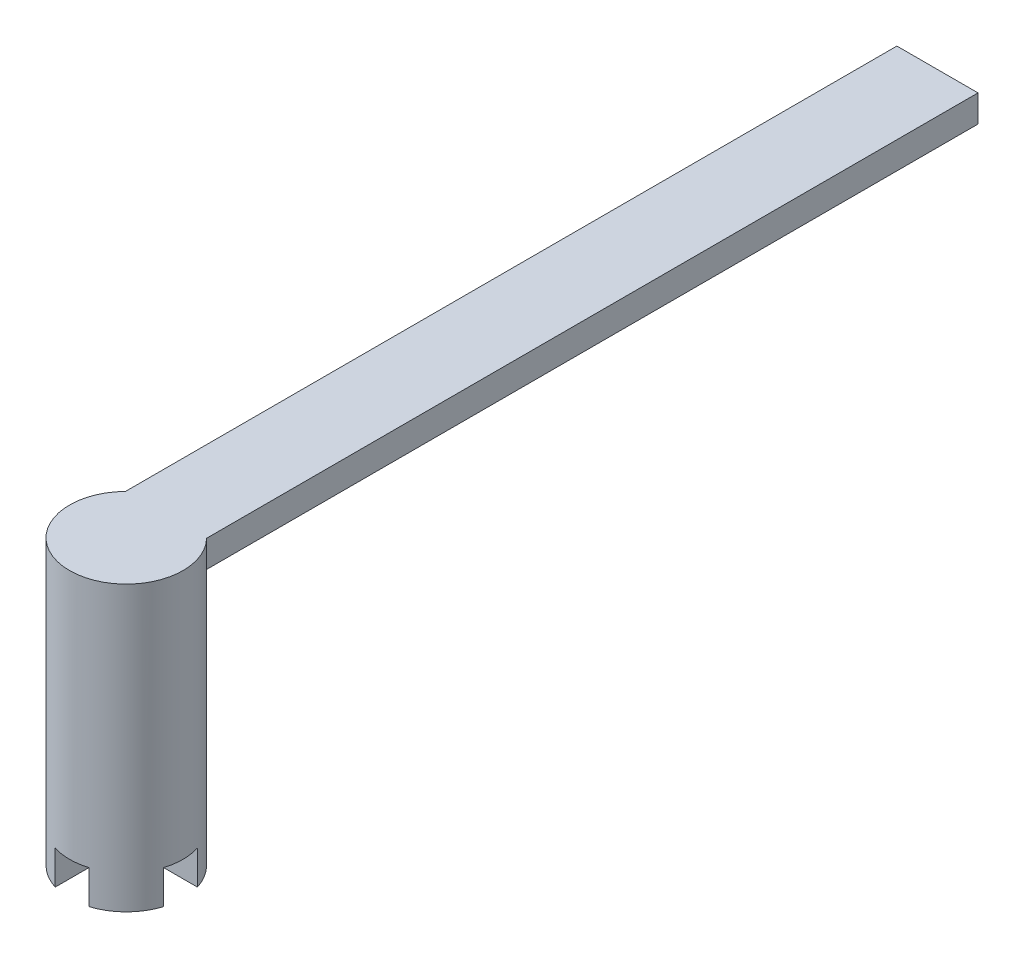
ISO-10303-21;
HEADER;
FILE_DESCRIPTION(('STEP AP214'),'2;1');
FILE_NAME('part.step','',(''),(''),'','','');
FILE_SCHEMA(('AUTOMOTIVE_DESIGN { 1 0 10303 214 1 1 1 1 }'));
ENDSEC;
DATA;
#1=APPLICATION_CONTEXT('core data for automotive mechanical design processes');
#2=APPLICATION_PROTOCOL_DEFINITION('international standard','automotive_design',2000,#1);
#3=PRODUCT_CONTEXT('',#1,'mechanical');
#4=PRODUCT('Part','Part','',(#3));
#5=PRODUCT_RELATED_PRODUCT_CATEGORY('part','',(#4));
#6=PRODUCT_DEFINITION_FORMATION('','',#4);
#7=PRODUCT_DEFINITION_CONTEXT('part definition',#1,'design');
#8=PRODUCT_DEFINITION('design','',#6,#7);
#9=PRODUCT_DEFINITION_SHAPE('','',#8);
#10=(LENGTH_UNIT() NAMED_UNIT(*) SI_UNIT(.MILLI.,.METRE.));
#11=(NAMED_UNIT(*) PLANE_ANGLE_UNIT() SI_UNIT($,.RADIAN.));
#12=(NAMED_UNIT(*) SI_UNIT($,.STERADIAN.) SOLID_ANGLE_UNIT());
#13=UNCERTAINTY_MEASURE_WITH_UNIT(LENGTH_MEASURE(1.E-05),#10,'distance_accuracy_value','');
#14=(GEOMETRIC_REPRESENTATION_CONTEXT(3) GLOBAL_UNCERTAINTY_ASSIGNED_CONTEXT((#13)) GLOBAL_UNIT_ASSIGNED_CONTEXT((#10,
#11,#12)) REPRESENTATION_CONTEXT('',''));
#15=CARTESIAN_POINT('',(0.,0.,0.));
#16=DIRECTION('',(0.,0.,1.));
#17=DIRECTION('',(1.,0.,0.));
#18=AXIS2_PLACEMENT_3D('',#15,#16,#17);
#19=CARTESIAN_POINT('',(0.,2.54,0.));
#20=DIRECTION('',(0.,-1.,0.));
#21=DIRECTION('',(0.,0.,-1.));
#22=AXIS2_PLACEMENT_3D('',#19,#20,#21);
#23=CYLINDRICAL_SURFACE('',#22,5.334);
#24=DIRECTION('',(0.,-1.,0.));
#25=VECTOR('',#24,1.);
#26=CARTESIAN_POINT('',(-3.81,2.54,-3.73302236800156));
#27=LINE('',#26,#25);
#28=CARTESIAN_POINT('',(-3.81,2.54,-3.73302236800156));
#29=VERTEX_POINT('',#28);
#30=CARTESIAN_POINT('',(-3.81,0.,-3.73302236800156));
#31=VERTEX_POINT('',#30);
#32=EDGE_CURVE('E62',#29,#31,#27,.T.);
#33=ORIENTED_EDGE('',*,*,#32,.T.);
#34=CARTESIAN_POINT('',(0.,0.,0.));
#35=DIRECTION('',(0.,-1.,0.));
#36=DIRECTION('',(0.,0.,-1.));
#37=AXIS2_PLACEMENT_3D('',#34,#35,#36);
#38=CIRCLE('',#37,5.334);
#39=CARTESIAN_POINT('',(3.81,0.,-3.73302236800156));
#40=VERTEX_POINT('',#39);
#41=EDGE_CURVE('E11',#31,#40,#38,.T.);
#42=ORIENTED_EDGE('',*,*,#41,.T.);
#43=DIRECTION('',(0.,-1.,0.));
#44=VECTOR('',#43,1.);
#45=CARTESIAN_POINT('',(3.81,2.54,-3.73302236800156));
#46=LINE('',#45,#44);
#47=CARTESIAN_POINT('',(3.81,2.54,-3.73302236800156));
#48=VERTEX_POINT('',#47);
#49=EDGE_CURVE('E45',#48,#40,#46,.T.);
#50=ORIENTED_EDGE('',*,*,#49,.F.);
#51=CARTESIAN_POINT('',(0.,2.54,0.));
#52=DIRECTION('',(0.,1.,0.));
#53=DIRECTION('',(0.,0.,1.));
#54=AXIS2_PLACEMENT_3D('',#51,#52,#53);
#55=CIRCLE('',#54,5.334);
#56=EDGE_CURVE('E195',#29,#48,#55,.T.);
#57=ORIENTED_EDGE('',*,*,#56,.F.);
#58=EDGE_LOOP('',(#33,#42,#50,#57));
#59=FACE_BOUND('',#58,.T.);
#60=DIRECTION('',(0.,-1.,0.));
#61=VECTOR('',#60,1.);
#62=CARTESIAN_POINT('',(5.09228826265756,-20.955,1.5875));
#63=LINE('',#62,#61);
#64=CARTESIAN_POINT('',(5.09228826265756,-20.955,1.5875));
#65=VERTEX_POINT('',#64);
#66=CARTESIAN_POINT('',(5.09228826265756,-24.13,1.5875));
#67=VERTEX_POINT('',#66);
#68=EDGE_CURVE('E456',#65,#67,#63,.T.);
#69=ORIENTED_EDGE('',*,*,#68,.F.);
#70=CARTESIAN_POINT('',(0.,-20.955,0.));
#71=DIRECTION('',(0.,-1.,0.));
#72=DIRECTION('',(0.,0.,-1.));
#73=AXIS2_PLACEMENT_3D('',#70,#71,#72);
#74=CIRCLE('',#73,5.334);
#75=CARTESIAN_POINT('',(5.09228826265756,-20.955,-1.5875));
#76=VERTEX_POINT('',#75);
#77=EDGE_CURVE('E488',#76,#65,#74,.T.);
#78=ORIENTED_EDGE('',*,*,#77,.F.);
#79=DIRECTION('',(0.,-1.,0.));
#80=VECTOR('',#79,1.);
#81=CARTESIAN_POINT('',(5.09228826265756,-20.955,-1.5875));
#82=LINE('',#81,#80);
#83=CARTESIAN_POINT('',(5.09228826265756,-24.13,-1.5875));
#84=VERTEX_POINT('',#83);
#85=EDGE_CURVE('E458',#76,#84,#82,.T.);
#86=ORIENTED_EDGE('',*,*,#85,.T.);
#87=CARTESIAN_POINT('',(0.,-24.13,0.));
#88=DIRECTION('',(0.,-1.,0.));
#89=DIRECTION('',(0.,0.,-1.));
#90=AXIS2_PLACEMENT_3D('',#87,#88,#89);
#91=CIRCLE('',#90,5.334);
#92=CARTESIAN_POINT('',(1.5875,-24.13,-5.09228826265756));
#93=VERTEX_POINT('',#92);
#94=EDGE_CURVE('E190',#93,#84,#91,.T.);
#95=ORIENTED_EDGE('',*,*,#94,.F.);
#96=DIRECTION('',(0.,-1.,0.));
#97=VECTOR('',#96,1.);
#98=CARTESIAN_POINT('',(1.5875,-20.955,-5.09228826265756));
#99=LINE('',#98,#97);
#100=CARTESIAN_POINT('',(1.5875,-20.955,-5.09228826265756));
#101=VERTEX_POINT('',#100);
#102=EDGE_CURVE('E462',#101,#93,#99,.T.);
#103=ORIENTED_EDGE('',*,*,#102,.F.);
#104=CARTESIAN_POINT('',(0.,-20.955,0.));
#105=DIRECTION('',(0.,-1.,0.));
#106=DIRECTION('',(0.,0.,-1.));
#107=AXIS2_PLACEMENT_3D('',#104,#105,#106);
#108=CIRCLE('',#107,5.334);
#109=CARTESIAN_POINT('',(-1.5875,-20.955,-5.09228826265756));
#110=VERTEX_POINT('',#109);
#111=EDGE_CURVE('E466',#110,#101,#108,.T.);
#112=ORIENTED_EDGE('',*,*,#111,.F.);
#113=DIRECTION('',(0.,-1.,0.));
#114=VECTOR('',#113,1.);
#115=CARTESIAN_POINT('',(-1.5875,-20.955,-5.09228826265756));
#116=LINE('',#115,#114);
#117=CARTESIAN_POINT('',(-1.5875,-24.13,-5.09228826265756));
#118=VERTEX_POINT('',#117);
#119=EDGE_CURVE('E184',#110,#118,#116,.T.);
#120=ORIENTED_EDGE('',*,*,#119,.T.);
#121=CARTESIAN_POINT('',(-5.09228826265756,-24.13,-1.5875));
#122=VERTEX_POINT('',#121);
#123=EDGE_CURVE('E182',#122,#118,#91,.T.);
#124=ORIENTED_EDGE('',*,*,#123,.F.);
#125=DIRECTION('',(0.,-1.,0.));
#126=VECTOR('',#125,1.);
#127=CARTESIAN_POINT('',(-5.09228826265756,-20.955,-1.5875));
#128=LINE('',#127,#126);
#129=CARTESIAN_POINT('',(-5.09228826265756,-20.955,-1.5875));
#130=VERTEX_POINT('',#129);
#131=EDGE_CURVE('E53',#130,#122,#128,.T.);
#132=ORIENTED_EDGE('',*,*,#131,.F.);
#133=CARTESIAN_POINT('',(0.,-20.955,0.));
#134=DIRECTION('',(0.,-1.,0.));
#135=DIRECTION('',(0.,0.,-1.));
#136=AXIS2_PLACEMENT_3D('',#133,#134,#135);
#137=CIRCLE('',#136,5.334);
#138=CARTESIAN_POINT('',(-5.09228826265756,-20.955,1.5875));
#139=VERTEX_POINT('',#138);
#140=EDGE_CURVE('E167',#139,#130,#137,.T.);
#141=ORIENTED_EDGE('',*,*,#140,.F.);
#142=DIRECTION('',(0.,-1.,0.));
#143=VECTOR('',#142,1.);
#144=CARTESIAN_POINT('',(-5.09228826265756,-20.955,1.5875));
#145=LINE('',#144,#143);
#146=CARTESIAN_POINT('',(-5.09228826265756,-24.13,1.5875));
#147=VERTEX_POINT('',#146);
#148=EDGE_CURVE('E445',#139,#147,#145,.T.);
#149=ORIENTED_EDGE('',*,*,#148,.T.);
#150=CARTESIAN_POINT('',(-1.5875,-24.13,5.09228826265756));
#151=VERTEX_POINT('',#150);
#152=EDGE_CURVE('E469',#151,#147,#91,.T.);
#153=ORIENTED_EDGE('',*,*,#152,.F.);
#154=DIRECTION('',(0.,-1.,0.));
#155=VECTOR('',#154,1.);
#156=CARTESIAN_POINT('',(-1.5875,-20.955,5.09228826265756));
#157=LINE('',#156,#155);
#158=CARTESIAN_POINT('',(-1.5875,-20.955,5.09228826265756));
#159=VERTEX_POINT('',#158);
#160=EDGE_CURVE('E449',#159,#151,#157,.T.);
#161=ORIENTED_EDGE('',*,*,#160,.F.);
#162=CARTESIAN_POINT('',(0.,-20.955,0.));
#163=DIRECTION('',(0.,-1.,0.));
#164=DIRECTION('',(0.,0.,-1.));
#165=AXIS2_PLACEMENT_3D('',#162,#163,#164);
#166=CIRCLE('',#165,5.334);
#167=CARTESIAN_POINT('',(1.5875,-20.955,5.09228826265756));
#168=VERTEX_POINT('',#167);
#169=EDGE_CURVE('E479',#168,#159,#166,.T.);
#170=ORIENTED_EDGE('',*,*,#169,.F.);
#171=DIRECTION('',(0.,-1.,0.));
#172=VECTOR('',#171,1.);
#173=CARTESIAN_POINT('',(1.5875,-20.955,5.09228826265756));
#174=LINE('',#173,#172);
#175=CARTESIAN_POINT('',(1.5875,-24.13,5.09228826265756));
#176=VERTEX_POINT('',#175);
#177=EDGE_CURVE('E451',#168,#176,#174,.T.);
#178=ORIENTED_EDGE('',*,*,#177,.T.);
#179=EDGE_CURVE('E194',#67,#176,#91,.T.);
#180=ORIENTED_EDGE('',*,*,#179,.F.);
#181=EDGE_LOOP('',(#69,#78,#86,#95,#103,#112,#120,#124,#132,#141,#149,#153,#161,#170,#178,#180));
#182=FACE_BOUND('',#181,.T.);
#183=ADVANCED_FACE('F37',(#59,#182),#23,.T.);
#184=CARTESIAN_POINT('',(0.,-24.13,0.));
#185=DIRECTION('',(0.,-1.,0.));
#186=DIRECTION('',(0.,0.,-1.));
#187=AXIS2_PLACEMENT_3D('',#184,#185,#186);
#188=PLANE('',#187);
#189=ORIENTED_EDGE('',*,*,#152,.T.);
#190=DIRECTION('',(1.,0.,0.));
#191=VECTOR('',#190,1.);
#192=CARTESIAN_POINT('',(0.,-24.13,1.5875));
#193=LINE('',#192,#191);
#194=CARTESIAN_POINT('',(-1.5875,-24.13,1.5875));
#195=VERTEX_POINT('',#194);
#196=EDGE_CURVE('E176',#147,#195,#193,.T.);
#197=ORIENTED_EDGE('',*,*,#196,.T.);
#198=DIRECTION('',(0.,0.,-1.));
#199=VECTOR('',#198,1.);
#200=CARTESIAN_POINT('',(-1.5875,-24.13,0.));
#201=LINE('',#200,#199);
#202=EDGE_CURVE('E440',#151,#195,#201,.T.);
#203=ORIENTED_EDGE('',*,*,#202,.F.);
#204=EDGE_LOOP('',(#189,#197,#203));
#205=FACE_BOUND('',#204,.T.);
#206=ADVANCED_FACE('F244',(#205),#188,.T.);
#207=ORIENTED_EDGE('',*,*,#179,.T.);
#208=DIRECTION('',(0.,0.,-1.));
#209=VECTOR('',#208,1.);
#210=CARTESIAN_POINT('',(1.5875,-24.13,0.));
#211=LINE('',#210,#209);
#212=CARTESIAN_POINT('',(1.5875,-24.13,1.5875));
#213=VERTEX_POINT('',#212);
#214=EDGE_CURVE('E432',#176,#213,#211,.T.);
#215=ORIENTED_EDGE('',*,*,#214,.T.);
#216=DIRECTION('',(1.,0.,0.));
#217=VECTOR('',#216,1.);
#218=CARTESIAN_POINT('',(0.,-24.13,1.5875));
#219=LINE('',#218,#217);
#220=EDGE_CURVE('E429',#213,#67,#219,.T.);
#221=ORIENTED_EDGE('',*,*,#220,.T.);
#222=EDGE_LOOP('',(#207,#215,#221));
#223=FACE_BOUND('',#222,.T.);
#224=ADVANCED_FACE('F252',(#223),#188,.T.);
#225=DIRECTION('',(1.,0.,0.));
#226=VECTOR('',#225,1.);
#227=CARTESIAN_POINT('',(0.,-24.13,-1.5875));
#228=LINE('',#227,#226);
#229=CARTESIAN_POINT('',(1.5875,-24.13,-1.5875));
#230=VERTEX_POINT('',#229);
#231=EDGE_CURVE('E424',#230,#84,#228,.T.);
#232=ORIENTED_EDGE('',*,*,#231,.F.);
#233=DIRECTION('',(0.,0.,-1.));
#234=VECTOR('',#233,1.);
#235=CARTESIAN_POINT('',(1.5875,-24.13,0.));
#236=LINE('',#235,#234);
#237=EDGE_CURVE('E426',#230,#93,#236,.T.);
#238=ORIENTED_EDGE('',*,*,#237,.T.);
#239=ORIENTED_EDGE('',*,*,#94,.T.);
#240=EDGE_LOOP('',(#232,#238,#239));
#241=FACE_BOUND('',#240,.T.);
#242=ADVANCED_FACE('F245',(#241),#188,.T.);
#243=CARTESIAN_POINT('',(0.,0.,0.));
#244=DIRECTION('',(0.,1.,0.));
#245=DIRECTION('',(0.,0.,1.));
#246=AXIS2_PLACEMENT_3D('',#243,#244,#245);
#247=PLANE('',#246);
#248=ORIENTED_EDGE('',*,*,#41,.F.);
#249=DIRECTION('',(0.,0.,-1.));
#250=VECTOR('',#249,1.);
#251=CARTESIAN_POINT('',(-3.81,0.,0.));
#252=LINE('',#251,#250);
#253=CARTESIAN_POINT('',(-3.81,0.,-76.2));
#254=VERTEX_POINT('',#253);
#255=EDGE_CURVE('E197',#31,#254,#252,.T.);
#256=ORIENTED_EDGE('',*,*,#255,.T.);
#257=DIRECTION('',(1.,0.,0.));
#258=VECTOR('',#257,1.);
#259=CARTESIAN_POINT('',(0.,0.,-76.2));
#260=LINE('',#259,#258);
#261=CARTESIAN_POINT('',(3.80999999999997,0.,-76.2));
#262=VERTEX_POINT('',#261);
#263=EDGE_CURVE('E204',#254,#262,#260,.T.);
#264=ORIENTED_EDGE('',*,*,#263,.T.);
#265=DIRECTION('',(0.,0.,-1.));
#266=VECTOR('',#265,1.);
#267=CARTESIAN_POINT('',(3.81,0.,0.));
#268=LINE('',#267,#266);
#269=EDGE_CURVE('E193',#40,#262,#268,.T.);
#270=ORIENTED_EDGE('',*,*,#269,.F.);
#271=EDGE_LOOP('',(#248,#256,#264,#270));
#272=FACE_BOUND('',#271,.T.);
#273=ADVANCED_FACE('F220',(#272),#247,.F.);
#274=CARTESIAN_POINT('',(3.81,2.54,0.));
#275=DIRECTION('',(-1.,0.,0.));
#276=DIRECTION('',(0.,0.,1.));
#277=AXIS2_PLACEMENT_3D('',#274,#275,#276);
#278=PLANE('',#277);
#279=ORIENTED_EDGE('',*,*,#269,.T.);
#280=DIRECTION('',(0.,-1.,0.));
#281=VECTOR('',#280,1.);
#282=CARTESIAN_POINT('',(3.80999999999997,2.54,-76.2));
#283=LINE('',#282,#281);
#284=CARTESIAN_POINT('',(3.80999999999997,2.54,-76.2));
#285=VERTEX_POINT('',#284);
#286=EDGE_CURVE('E209',#285,#262,#283,.T.);
#287=ORIENTED_EDGE('',*,*,#286,.F.);
#288=DIRECTION('',(0.,0.,-1.));
#289=VECTOR('',#288,1.);
#290=CARTESIAN_POINT('',(3.81,2.54,0.));
#291=LINE('',#290,#289);
#292=EDGE_CURVE('E87',#48,#285,#291,.T.);
#293=ORIENTED_EDGE('',*,*,#292,.F.);
#294=ORIENTED_EDGE('',*,*,#49,.T.);
#295=EDGE_LOOP('',(#279,#287,#293,#294));
#296=FACE_BOUND('',#295,.T.);
#297=ADVANCED_FACE('F228',(#296),#278,.F.);
#298=CARTESIAN_POINT('',(0.,2.54,-76.2));
#299=DIRECTION('',(0.,0.,-1.));
#300=DIRECTION('',(-1.,0.,0.));
#301=AXIS2_PLACEMENT_3D('',#298,#299,#300);
#302=PLANE('',#301);
#303=ORIENTED_EDGE('',*,*,#263,.F.);
#304=DIRECTION('',(0.,-1.,0.));
#305=VECTOR('',#304,1.);
#306=CARTESIAN_POINT('',(-3.81,2.54,-76.2));
#307=LINE('',#306,#305);
#308=CARTESIAN_POINT('',(-3.81,2.54,-76.2));
#309=VERTEX_POINT('',#308);
#310=EDGE_CURVE('E207',#309,#254,#307,.T.);
#311=ORIENTED_EDGE('',*,*,#310,.F.);
#312=DIRECTION('',(1.,0.,0.));
#313=VECTOR('',#312,1.);
#314=CARTESIAN_POINT('',(0.,2.54,-76.2));
#315=LINE('',#314,#313);
#316=EDGE_CURVE('E199',#309,#285,#315,.T.);
#317=ORIENTED_EDGE('',*,*,#316,.T.);
#318=ORIENTED_EDGE('',*,*,#286,.T.);
#319=EDGE_LOOP('',(#303,#311,#317,#318));
#320=FACE_BOUND('',#319,.T.);
#321=ADVANCED_FACE('F226',(#320),#302,.T.);
#322=CARTESIAN_POINT('',(-3.81,2.54,0.));
#323=DIRECTION('',(-1.,0.,0.));
#324=DIRECTION('',(0.,0.,1.));
#325=AXIS2_PLACEMENT_3D('',#322,#323,#324);
#326=PLANE('',#325);
#327=ORIENTED_EDGE('',*,*,#255,.F.);
#328=ORIENTED_EDGE('',*,*,#32,.F.);
#329=DIRECTION('',(0.,0.,-1.));
#330=VECTOR('',#329,1.);
#331=CARTESIAN_POINT('',(-3.81,2.54,0.));
#332=LINE('',#331,#330);
#333=EDGE_CURVE('E202',#29,#309,#332,.T.);
#334=ORIENTED_EDGE('',*,*,#333,.T.);
#335=ORIENTED_EDGE('',*,*,#310,.T.);
#336=EDGE_LOOP('',(#327,#328,#334,#335));
#337=FACE_BOUND('',#336,.T.);
#338=ADVANCED_FACE('F222',(#337),#326,.T.);
#339=CARTESIAN_POINT('',(0.,2.54,0.));
#340=DIRECTION('',(0.,1.,0.));
#341=DIRECTION('',(0.,0.,1.));
#342=AXIS2_PLACEMENT_3D('',#339,#340,#341);
#343=PLANE('',#342);
#344=ORIENTED_EDGE('',*,*,#56,.T.);
#345=ORIENTED_EDGE('',*,*,#292,.T.);
#346=ORIENTED_EDGE('',*,*,#316,.F.);
#347=ORIENTED_EDGE('',*,*,#333,.F.);
#348=EDGE_LOOP('',(#344,#345,#346,#347));
#349=FACE_BOUND('',#348,.T.);
#350=ADVANCED_FACE('F233',(#349),#343,.T.);
#351=DIRECTION('',(0.,0.,-1.));
#352=VECTOR('',#351,1.);
#353=CARTESIAN_POINT('',(-1.5875,-24.13,0.));
#354=LINE('',#353,#352);
#355=CARTESIAN_POINT('',(-1.5875,-24.13,-1.5875));
#356=VERTEX_POINT('',#355);
#357=EDGE_CURVE('E434',#356,#118,#354,.T.);
#358=ORIENTED_EDGE('',*,*,#357,.F.);
#359=DIRECTION('',(1.,0.,0.));
#360=VECTOR('',#359,1.);
#361=CARTESIAN_POINT('',(0.,-24.13,-1.5875));
#362=LINE('',#361,#360);
#363=EDGE_CURVE('E468',#122,#356,#362,.T.);
#364=ORIENTED_EDGE('',*,*,#363,.F.);
#365=ORIENTED_EDGE('',*,*,#123,.T.);
#366=EDGE_LOOP('',(#358,#364,#365));
#367=FACE_BOUND('',#366,.T.);
#368=ADVANCED_FACE('F235',(#367),#188,.T.);
#369=CARTESIAN_POINT('',(0.,-20.955,1.5875));
#370=DIRECTION('',(0.,0.,-1.));
#371=DIRECTION('',(-1.,0.,0.));
#372=AXIS2_PLACEMENT_3D('',#369,#370,#371);
#373=PLANE('',#372);
#374=ORIENTED_EDGE('',*,*,#196,.F.);
#375=ORIENTED_EDGE('',*,*,#148,.F.);
#376=DIRECTION('',(1.,0.,0.));
#377=VECTOR('',#376,1.);
#378=CARTESIAN_POINT('',(0.,-20.955,1.5875));
#379=LINE('',#378,#377);
#380=CARTESIAN_POINT('',(-1.5875,-20.955,1.5875));
#381=VERTEX_POINT('',#380);
#382=EDGE_CURVE('E173',#139,#381,#379,.T.);
#383=ORIENTED_EDGE('',*,*,#382,.T.);
#384=DIRECTION('',(0.,-1.,0.));
#385=VECTOR('',#384,1.);
#386=CARTESIAN_POINT('',(-1.5875,-20.955,1.5875));
#387=LINE('',#386,#385);
#388=EDGE_CURVE('E447',#381,#195,#387,.T.);
#389=ORIENTED_EDGE('',*,*,#388,.T.);
#390=EDGE_LOOP('',(#374,#375,#383,#389));
#391=FACE_BOUND('',#390,.T.);
#392=ADVANCED_FACE('F241',(#391),#373,.T.);
#393=CARTESIAN_POINT('',(-1.5875,-20.955,0.));
#394=DIRECTION('',(-1.,0.,0.));
#395=DIRECTION('',(0.,0.,1.));
#396=AXIS2_PLACEMENT_3D('',#393,#394,#395);
#397=PLANE('',#396);
#398=ORIENTED_EDGE('',*,*,#202,.T.);
#399=ORIENTED_EDGE('',*,*,#388,.F.);
#400=DIRECTION('',(0.,0.,-1.));
#401=VECTOR('',#400,1.);
#402=CARTESIAN_POINT('',(-1.5875,-20.955,0.));
#403=LINE('',#402,#401);
#404=EDGE_CURVE('E186',#159,#381,#403,.T.);
#405=ORIENTED_EDGE('',*,*,#404,.F.);
#406=ORIENTED_EDGE('',*,*,#160,.T.);
#407=EDGE_LOOP('',(#398,#399,#405,#406));
#408=FACE_BOUND('',#407,.T.);
#409=ADVANCED_FACE('F281',(#408),#397,.F.);
#410=CARTESIAN_POINT('',(1.5875,-20.955,0.));
#411=DIRECTION('',(-1.,0.,0.));
#412=DIRECTION('',(0.,0.,1.));
#413=AXIS2_PLACEMENT_3D('',#410,#411,#412);
#414=PLANE('',#413);
#415=ORIENTED_EDGE('',*,*,#214,.F.);
#416=ORIENTED_EDGE('',*,*,#177,.F.);
#417=DIRECTION('',(0.,0.,-1.));
#418=VECTOR('',#417,1.);
#419=CARTESIAN_POINT('',(1.5875,-20.955,0.));
#420=LINE('',#419,#418);
#421=CARTESIAN_POINT('',(1.5875,-20.955,1.5875));
#422=VERTEX_POINT('',#421);
#423=EDGE_CURVE('E481',#168,#422,#420,.T.);
#424=ORIENTED_EDGE('',*,*,#423,.T.);
#425=DIRECTION('',(0.,-1.,0.));
#426=VECTOR('',#425,1.);
#427=CARTESIAN_POINT('',(1.5875,-20.955,1.5875));
#428=LINE('',#427,#426);
#429=EDGE_CURVE('E454',#422,#213,#428,.T.);
#430=ORIENTED_EDGE('',*,*,#429,.T.);
#431=EDGE_LOOP('',(#415,#416,#424,#430));
#432=FACE_BOUND('',#431,.T.);
#433=ADVANCED_FACE('F277',(#432),#414,.T.);
#434=CARTESIAN_POINT('',(0.,-20.955,1.5875));
#435=DIRECTION('',(0.,0.,-1.));
#436=DIRECTION('',(-1.,0.,0.));
#437=AXIS2_PLACEMENT_3D('',#434,#435,#436);
#438=PLANE('',#437);
#439=ORIENTED_EDGE('',*,*,#220,.F.);
#440=ORIENTED_EDGE('',*,*,#429,.F.);
#441=DIRECTION('',(1.,0.,0.));
#442=VECTOR('',#441,1.);
#443=CARTESIAN_POINT('',(0.,-20.955,1.5875));
#444=LINE('',#443,#442);
#445=EDGE_CURVE('E485',#422,#65,#444,.T.);
#446=ORIENTED_EDGE('',*,*,#445,.T.);
#447=ORIENTED_EDGE('',*,*,#68,.T.);
#448=EDGE_LOOP('',(#439,#440,#446,#447));
#449=FACE_BOUND('',#448,.T.);
#450=ADVANCED_FACE('F273',(#449),#438,.T.);
#451=CARTESIAN_POINT('',(0.,-20.955,-1.5875));
#452=DIRECTION('',(0.,0.,-1.));
#453=DIRECTION('',(-1.,0.,0.));
#454=AXIS2_PLACEMENT_3D('',#451,#452,#453);
#455=PLANE('',#454);
#456=ORIENTED_EDGE('',*,*,#231,.T.);
#457=ORIENTED_EDGE('',*,*,#85,.F.);
#458=DIRECTION('',(1.,0.,0.));
#459=VECTOR('',#458,1.);
#460=CARTESIAN_POINT('',(0.,-20.955,-1.5875));
#461=LINE('',#460,#459);
#462=CARTESIAN_POINT('',(1.5875,-20.955,-1.5875));
#463=VERTEX_POINT('',#462);
#464=EDGE_CURVE('E498',#463,#76,#461,.T.);
#465=ORIENTED_EDGE('',*,*,#464,.F.);
#466=DIRECTION('',(0.,-1.,0.));
#467=VECTOR('',#466,1.);
#468=CARTESIAN_POINT('',(1.5875,-20.955,-1.5875));
#469=LINE('',#468,#467);
#470=EDGE_CURVE('E460',#463,#230,#469,.T.);
#471=ORIENTED_EDGE('',*,*,#470,.T.);
#472=EDGE_LOOP('',(#456,#457,#465,#471));
#473=FACE_BOUND('',#472,.T.);
#474=ADVANCED_FACE('F269',(#473),#455,.F.);
#475=CARTESIAN_POINT('',(1.5875,-20.955,0.));
#476=DIRECTION('',(-1.,0.,0.));
#477=DIRECTION('',(0.,0.,1.));
#478=AXIS2_PLACEMENT_3D('',#475,#476,#477);
#479=PLANE('',#478);
#480=ORIENTED_EDGE('',*,*,#237,.F.);
#481=ORIENTED_EDGE('',*,*,#470,.F.);
#482=DIRECTION('',(0.,0.,-1.));
#483=VECTOR('',#482,1.);
#484=CARTESIAN_POINT('',(1.5875,-20.955,0.));
#485=LINE('',#484,#483);
#486=EDGE_CURVE('E494',#463,#101,#485,.T.);
#487=ORIENTED_EDGE('',*,*,#486,.T.);
#488=ORIENTED_EDGE('',*,*,#102,.T.);
#489=EDGE_LOOP('',(#480,#481,#487,#488));
#490=FACE_BOUND('',#489,.T.);
#491=ADVANCED_FACE('F265',(#490),#479,.T.);
#492=CARTESIAN_POINT('',(-1.5875,-20.955,0.));
#493=DIRECTION('',(-1.,0.,0.));
#494=DIRECTION('',(0.,0.,1.));
#495=AXIS2_PLACEMENT_3D('',#492,#493,#494);
#496=PLANE('',#495);
#497=ORIENTED_EDGE('',*,*,#357,.T.);
#498=ORIENTED_EDGE('',*,*,#119,.F.);
#499=DIRECTION('',(0.,0.,-1.));
#500=VECTOR('',#499,1.);
#501=CARTESIAN_POINT('',(-1.5875,-20.955,0.));
#502=LINE('',#501,#500);
#503=CARTESIAN_POINT('',(-1.5875,-20.955,-1.5875));
#504=VERTEX_POINT('',#503);
#505=EDGE_CURVE('E166',#504,#110,#502,.T.);
#506=ORIENTED_EDGE('',*,*,#505,.F.);
#507=DIRECTION('',(0.,-1.,0.));
#508=VECTOR('',#507,1.);
#509=CARTESIAN_POINT('',(-1.5875,-20.955,-1.5875));
#510=LINE('',#509,#508);
#511=EDGE_CURVE('E162',#504,#356,#510,.T.);
#512=ORIENTED_EDGE('',*,*,#511,.T.);
#513=EDGE_LOOP('',(#497,#498,#506,#512));
#514=FACE_BOUND('',#513,.T.);
#515=ADVANCED_FACE('F262',(#514),#496,.F.);
#516=CARTESIAN_POINT('',(0.,-20.955,-1.5875));
#517=DIRECTION('',(0.,0.,-1.));
#518=DIRECTION('',(-1.,0.,0.));
#519=AXIS2_PLACEMENT_3D('',#516,#517,#518);
#520=PLANE('',#519);
#521=ORIENTED_EDGE('',*,*,#363,.T.);
#522=ORIENTED_EDGE('',*,*,#511,.F.);
#523=DIRECTION('',(1.,0.,0.));
#524=VECTOR('',#523,1.);
#525=CARTESIAN_POINT('',(0.,-20.955,-1.5875));
#526=LINE('',#525,#524);
#527=EDGE_CURVE('E159',#130,#504,#526,.T.);
#528=ORIENTED_EDGE('',*,*,#527,.F.);
#529=ORIENTED_EDGE('',*,*,#131,.T.);
#530=EDGE_LOOP('',(#521,#522,#528,#529));
#531=FACE_BOUND('',#530,.T.);
#532=ADVANCED_FACE('F161',(#531),#520,.F.);
#533=CARTESIAN_POINT('',(0.,-20.955,0.));
#534=DIRECTION('',(0.,-1.,0.));
#535=DIRECTION('',(0.,0.,-1.));
#536=AXIS2_PLACEMENT_3D('',#533,#534,#535);
#537=PLANE('',#536);
#538=ORIENTED_EDGE('',*,*,#140,.T.);
#539=ORIENTED_EDGE('',*,*,#527,.T.);
#540=ORIENTED_EDGE('',*,*,#505,.T.);
#541=ORIENTED_EDGE('',*,*,#111,.T.);
#542=ORIENTED_EDGE('',*,*,#486,.F.);
#543=ORIENTED_EDGE('',*,*,#464,.T.);
#544=ORIENTED_EDGE('',*,*,#77,.T.);
#545=ORIENTED_EDGE('',*,*,#445,.F.);
#546=ORIENTED_EDGE('',*,*,#423,.F.);
#547=ORIENTED_EDGE('',*,*,#169,.T.);
#548=ORIENTED_EDGE('',*,*,#404,.T.);
#549=ORIENTED_EDGE('',*,*,#382,.F.);
#550=EDGE_LOOP('',(#538,#539,#540,#541,#542,#543,#544,#545,#546,#547,#548,#549));
#551=FACE_BOUND('',#550,.T.);
#552=ADVANCED_FACE('F171',(#551),#537,.T.);
#553=CLOSED_SHELL('',(#183,#206,#224,#242,#273,#297,#321,#338,#350,#368,#392,#409,#433,#450,
#474,#491,#515,#532,#552));
#554=MANIFOLD_SOLID_BREP('B2',#553);
#555=ADVANCED_BREP_SHAPE_REPRESENTATION('',(#18,#554),#14);
#556=SHAPE_DEFINITION_REPRESENTATION(#9,#555);
ENDSEC;
END-ISO-10303-21;
